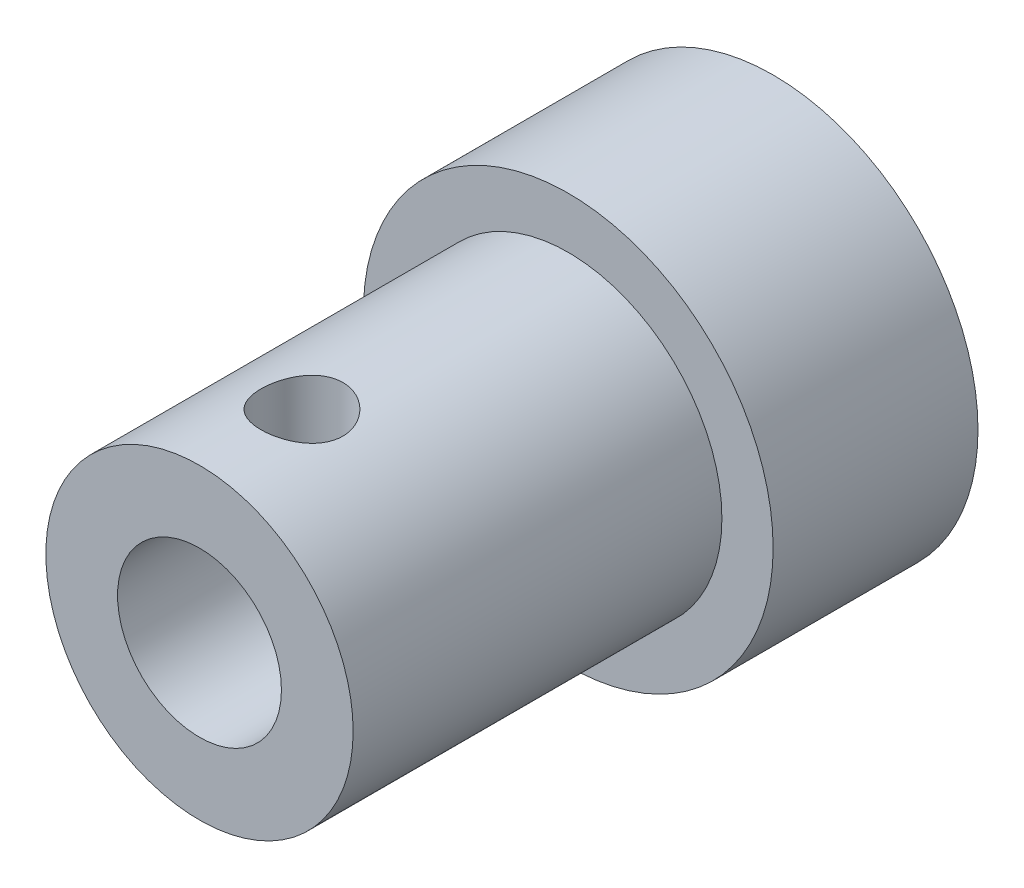
ISO-10303-21;
HEADER;
FILE_DESCRIPTION(('STEP AP214'),'2;1');
FILE_NAME('part.step','',(''),(''),'','','');
FILE_SCHEMA(('AUTOMOTIVE_DESIGN { 1 0 10303 214 1 1 1 1 }'));
ENDSEC;
DATA;
#1=APPLICATION_CONTEXT('core data for automotive mechanical design processes');
#2=APPLICATION_PROTOCOL_DEFINITION('international standard','automotive_design',2000,#1);
#3=PRODUCT_CONTEXT('',#1,'mechanical');
#4=PRODUCT('Part','Part','',(#3));
#5=PRODUCT_RELATED_PRODUCT_CATEGORY('part','',(#4));
#6=PRODUCT_DEFINITION_FORMATION('','',#4);
#7=PRODUCT_DEFINITION_CONTEXT('part definition',#1,'design');
#8=PRODUCT_DEFINITION('design','',#6,#7);
#9=PRODUCT_DEFINITION_SHAPE('','',#8);
#10=(LENGTH_UNIT() NAMED_UNIT(*) SI_UNIT(.MILLI.,.METRE.));
#11=(NAMED_UNIT(*) PLANE_ANGLE_UNIT() SI_UNIT($,.RADIAN.));
#12=(NAMED_UNIT(*) SI_UNIT($,.STERADIAN.) SOLID_ANGLE_UNIT());
#13=UNCERTAINTY_MEASURE_WITH_UNIT(LENGTH_MEASURE(1.E-05),#10,'distance_accuracy_value','');
#14=(GEOMETRIC_REPRESENTATION_CONTEXT(3) GLOBAL_UNCERTAINTY_ASSIGNED_CONTEXT((#13)) GLOBAL_UNIT_ASSIGNED_CONTEXT((#10,
#11,#12)) REPRESENTATION_CONTEXT('',''));
#15=CARTESIAN_POINT('',(0.,0.,0.));
#16=DIRECTION('',(0.,0.,1.));
#17=DIRECTION('',(1.,0.,0.));
#18=AXIS2_PLACEMENT_3D('',#15,#16,#17);
#19=CARTESIAN_POINT('',(0.,0.,-5.));
#20=DIRECTION('',(0.,0.,1.));
#21=DIRECTION('',(1.,0.,0.));
#22=AXIS2_PLACEMENT_3D('',#19,#20,#21);
#23=PLANE('',#22);
#24=CARTESIAN_POINT('',(1.63738784237748E-12,-7.,-5.));
#25=DIRECTION('',(0.,0.,-1.));
#26=DIRECTION('',(-1.,0.,0.));
#27=AXIS2_PLACEMENT_3D('',#24,#25,#26);
#28=CIRCLE('',#27,1.49999999999848);
#29=CARTESIAN_POINT('',(-1.49999999999684,-7.,-5.));
#30=VERTEX_POINT('',#29);
#31=EDGE_CURVE('E46',#30,#30,#28,.T.);
#32=ORIENTED_EDGE('',*,*,#31,.T.);
#33=EDGE_LOOP('',(#32));
#34=FACE_BOUND('',#33,.T.);
#35=ADVANCED_FACE('F33',(#34),#23,.F.);
#36=CARTESIAN_POINT('',(0.,7.,-5.));
#37=DIRECTION('',(0.,0.,-1.));
#38=DIRECTION('',(-1.,0.,0.));
#39=AXIS2_PLACEMENT_3D('',#36,#37,#38);
#40=CIRCLE('',#39,1.5);
#41=CARTESIAN_POINT('',(-1.5,7.,-5.));
#42=VERTEX_POINT('',#41);
#43=EDGE_CURVE('E51',#42,#42,#40,.T.);
#44=ORIENTED_EDGE('',*,*,#43,.T.);
#45=EDGE_LOOP('',(#44));
#46=FACE_BOUND('',#45,.T.);
#47=ADVANCED_FACE('F116',(#46),#23,.F.);
#48=CARTESIAN_POINT('',(-7.,-8.18693921188739E-13,-5.));
#49=DIRECTION('',(0.,0.,-1.));
#50=DIRECTION('',(-1.,0.,0.));
#51=AXIS2_PLACEMENT_3D('',#48,#49,#50);
#52=CIRCLE('',#51,1.49999999999924);
#53=CARTESIAN_POINT('',(-8.49999999999924,-8.18693921188739E-13,-5.));
#54=VERTEX_POINT('',#53);
#55=EDGE_CURVE('E125',#54,#54,#52,.T.);
#56=ORIENTED_EDGE('',*,*,#55,.T.);
#57=EDGE_LOOP('',(#56));
#58=FACE_BOUND('',#57,.T.);
#59=ADVANCED_FACE('F108',(#58),#23,.F.);
#60=CARTESIAN_POINT('',(0.,0.,-5.));
#61=DIRECTION('',(0.,0.,1.));
#62=DIRECTION('',(1.,0.,0.));
#63=AXIS2_PLACEMENT_3D('',#60,#61,#62);
#64=CYLINDRICAL_SURFACE('',#63,7.5);
#65=CARTESIAN_POINT('',(0.,0.,-3.));
#66=DIRECTION('',(0.,0.,1.));
#67=DIRECTION('',(1.,0.,0.));
#68=AXIS2_PLACEMENT_3D('',#65,#66,#67);
#69=CIRCLE('',#68,7.5);
#70=CARTESIAN_POINT('',(7.5,0.,-3.));
#71=VERTEX_POINT('',#70);
#72=EDGE_CURVE('E10',#71,#71,#69,.F.);
#73=ORIENTED_EDGE('',*,*,#72,.F.);
#74=EDGE_LOOP('',(#73));
#75=FACE_BOUND('',#74,.T.);
#76=CARTESIAN_POINT('',(0.,7.5,12.));
#77=CARTESIAN_POINT('',(0.110254555832854,7.49999833810161,11.9999973830651));
#78=CARTESIAN_POINT('',(0.220537160221841,7.49754486162151,11.9908523858103));
#79=CARTESIAN_POINT('',(0.437925451354464,7.48799573621659,11.9545787692613));
#80=CARTESIAN_POINT('',(0.545029583319086,7.48089785332586,11.9274414955739));
#81=CARTESIAN_POINT('',(0.752891589045312,7.4628433325279,11.856128333136));
#82=CARTESIAN_POINT('',(0.853657451015285,7.45189167130375,11.811974412334));
#83=CARTESIAN_POINT('',(1.04635368639266,7.42728699151678,11.7079627573334));
#84=CARTESIAN_POINT('',(1.13828347044963,7.4136337929518,11.6481039766407));
#85=CARTESIAN_POINT('',(1.31282950374002,7.38474614901995,11.5129164835866));
#86=CARTESIAN_POINT('',(1.39521168986279,7.36948467678681,11.4372913319917));
#87=CARTESIAN_POINT('',(1.54628713660638,7.33927409679591,11.2733515169366));
#88=CARTESIAN_POINT('',(1.61497863495664,7.32432502947243,11.1850352223825));
#89=CARTESIAN_POINT('',(1.73786409243415,7.29615537464372,10.9963517651746));
#90=CARTESIAN_POINT('',(1.79178877736487,7.28296888563239,10.8958036717383));
#91=CARTESIAN_POINT('',(1.88187548076994,7.26021477318187,10.6866598889076));
#92=CARTESIAN_POINT('',(1.91804077451369,7.25064648253265,10.5780656876686));
#93=CARTESIAN_POINT('',(1.97076920226504,7.23649115802399,10.358504462175));
#94=CARTESIAN_POINT('',(1.98775670244692,7.2317964781149,10.2476464600693));
#95=CARTESIAN_POINT('',(2.0029703470582,7.22759830916371,10.0245623166935));
#96=CARTESIAN_POINT('',(2.00119999705754,7.22809385014446,9.91233643497593));
#97=CARTESIAN_POINT('',(1.97928510002699,7.23412378802031,9.69301458462594));
#98=CARTESIAN_POINT('',(1.95965406064765,7.23951735511531,9.58586281796151));
#99=CARTESIAN_POINT('',(1.90339748722183,7.25451013080688,9.37643166554376));
#100=CARTESIAN_POINT('',(1.86677059492995,7.26410967552612,9.27415266992465));
#101=CARTESIAN_POINT('',(1.77714356965256,7.28655661748386,9.07603185619142));
#102=CARTESIAN_POINT('',(1.72396341137784,7.29943942818703,8.98027566071374));
#103=CARTESIAN_POINT('',(1.60286503823778,7.32698229642445,8.79886584114848));
#104=CARTESIAN_POINT('',(1.53494392224251,7.34164270355186,8.71321421084353));
#105=CARTESIAN_POINT('',(1.38366607263419,7.37167510629864,8.5515110025452));
#106=CARTESIAN_POINT('',(1.29987812728299,7.38705471488831,8.47586368168505));
#107=CARTESIAN_POINT('',(1.12061766820637,7.41636381276316,8.33961121964971));
#108=CARTESIAN_POINT('',(1.02514469420509,7.43029324488555,8.27900667129757));
#109=CARTESIAN_POINT('',(0.824598255497451,7.45521820398293,8.17438209717535));
#110=CARTESIAN_POINT('',(0.719484902551789,7.4662007283356,8.13043522955141));
#111=CARTESIAN_POINT('',(0.503002294390396,7.48390044400999,8.06095281118663));
#112=CARTESIAN_POINT('',(0.391634411928323,7.49061856733749,8.03541323727604));
#113=CARTESIAN_POINT('',(0.169254083145515,7.49889158558384,8.00410512308217));
#114=CARTESIAN_POINT('',(0.0583242376413805,7.50058997470959,7.99778696014913));
#115=CARTESIAN_POINT('',(-0.163010045901198,7.49904471691695,8.00358316424694));
#116=CARTESIAN_POINT('',(-0.273414537062113,7.49580158080353,8.01569562610577));
#117=CARTESIAN_POINT('',(-0.488602449901779,7.48483035496021,8.05755844745998));
#118=CARTESIAN_POINT('',(-0.593449852027781,7.4771802654633,8.08700224619776));
#119=CARTESIAN_POINT('',(-0.796706971176064,7.45826294894139,8.16233594450795));
#120=CARTESIAN_POINT('',(-0.895115989216027,7.44699532996161,8.20822762625055));
#121=CARTESIAN_POINT('',(-1.08483847466795,7.42175660559528,8.31617388718054));
#122=CARTESIAN_POINT('',(-1.17597518846118,7.40773686604957,8.37852746679774));
#123=CARTESIAN_POINT('',(-1.34668463539715,7.37861452365564,8.51725163015799));
#124=CARTESIAN_POINT('',(-1.42625507879918,7.3635117072752,8.59362498260105));
#125=CARTESIAN_POINT('',(-1.57388924478774,7.33339745866705,8.76078557749456));
#126=CARTESIAN_POINT('',(-1.64156519249816,7.31840061429312,8.85191856139517));
#127=CARTESIAN_POINT('',(-1.76067191185118,7.29066447182727,9.04456469609962));
#128=CARTESIAN_POINT('',(-1.81210336122161,7.27792507956316,9.1460774136223));
#129=CARTESIAN_POINT('',(-1.89687411586112,7.2562926837321,9.3560953070761));
#130=CARTESIAN_POINT('',(-1.93031812253958,7.24737748318009,9.46455581181758));
#131=CARTESIAN_POINT('',(-1.97841205118791,7.23439825126801,9.68583931967475));
#132=CARTESIAN_POINT('',(-1.99306677602478,7.23033298020014,9.79866120034792));
#133=CARTESIAN_POINT('',(-2.00288989653714,7.22761744573589,10.0214947878838));
#134=CARTESIAN_POINT('',(-1.99868155618109,7.22879397743239,10.1314773202583));
#135=CARTESIAN_POINT('',(-1.97234376000439,7.23602396081087,10.34910351401));
#136=CARTESIAN_POINT('',(-1.95021476535025,7.24207728699439,10.4567472355006));
#137=CARTESIAN_POINT('',(-1.88902515699699,7.25827571073158,10.6658557521298));
#138=CARTESIAN_POINT('',(-1.8500966107558,7.26838885019644,10.7673618427322));
#139=CARTESIAN_POINT('',(-1.75651554562386,7.29156818136177,10.9624788305341));
#140=CARTESIAN_POINT('',(-1.70186056024617,7.30463483621364,11.0560884863005));
#141=CARTESIAN_POINT('',(-1.57648909268817,7.3327292144046,11.2357303594966));
#142=CARTESIAN_POINT('',(-1.50534729767909,7.3478033310169,11.3214585349762));
#143=CARTESIAN_POINT('',(-1.349830535111,7.37795503783007,11.4799624516673));
#144=CARTESIAN_POINT('',(-1.26545235435875,7.39303262798441,11.5527350386688));
#145=CARTESIAN_POINT('',(-1.08367998108868,7.42187812403968,11.6847922376469));
#146=CARTESIAN_POINT('',(-0.986045961751779,7.43561111314551,11.7437550106493));
#147=CARTESIAN_POINT('',(-0.781888640416889,7.45983810102897,11.8443374159294));
#148=CARTESIAN_POINT('',(-0.675371094696297,7.47033417683594,11.8859681756636));
#149=CARTESIAN_POINT('',(-0.474374704880991,7.48554752513468,11.9452752854155));
#150=CARTESIAN_POINT('',(-0.380762016565036,7.49092770592602,11.9657493835925));
#151=CARTESIAN_POINT('',(-0.191439795317077,7.49815449036456,11.9931122061671));
#152=CARTESIAN_POINT('',(-0.0957304704048604,7.5000014429727,12.0000022722));
#153=CARTESIAN_POINT('',(0.,7.5,12.));
#154=B_SPLINE_CURVE_WITH_KNOTS('',3,(#76,#77,#78,#79,#80,#81,#82,#83,#84,#85,#86,#87,#88,#89,
#90,#91,#92,#93,#94,#95,#96,#97,#98,#99,#100,#101,#102,#103,#104,#105,#106,#107,#108,#109,#110,
#111,#112,#113,#114,#115,#116,#117,#118,#119,#120,#121,#122,#123,#124,#125,#126,#127,#128,#129,
#130,#131,#132,#133,#134,#135,#136,#137,#138,#139,#140,#141,#142,#143,#144,#145,#146,#147,#148,
#149,#150,#151,#152,#153),.UNSPECIFIED.,.T.,.F.,(4,2,2,2,2,2,2,2,2,2,2,2,2,2,2,2,2,2,2,2,2,2,2,
2,2,2,2,2,2,2,2,2,2,2,2,2,2,2,4),(0.,0.330412598949569,0.66098424376145,0.991130552971933,
1.32129886708675,1.65834897954967,1.99544244925149,2.33832582523229,2.681145941297,
3.01622158250468,3.3512346040432,3.67691002045997,4.0026114681294,4.33198673346498,
4.6614268811763,5.00161259812322,5.34181171937597,5.68348809603041,6.02508977190139,
6.35682717524547,6.6885302892535,7.01453535642116,7.34057575775614,7.6730028600455,
8.00549568258887,8.34736496382788,8.68921998024107,9.02906297699387,9.36881908663982,
9.69743342403611,10.0260393052059,10.352107654483,10.67822717123,11.0139433957139,
11.3497412433245,11.692722522809,12.0354832614518,12.3223981899334,12.6092847796638),.UNSPECIFIED.);
#155=CARTESIAN_POINT('',(0.,7.5,12.));
#156=VERTEX_POINT('',#155);
#157=EDGE_CURVE('E59',#156,#156,#154,.T.);
#158=ORIENTED_EDGE('',*,*,#157,.F.);
#159=EDGE_LOOP('',(#158));
#160=FACE_BOUND('',#159,.T.);
#161=CARTESIAN_POINT('',(0.,0.,15.));
#162=DIRECTION('',(0.,0.,1.));
#163=DIRECTION('',(1.,0.,0.));
#164=AXIS2_PLACEMENT_3D('',#161,#162,#163);
#165=CIRCLE('',#164,7.5);
#166=CARTESIAN_POINT('',(7.5,0.,15.));
#167=VERTEX_POINT('',#166);
#168=EDGE_CURVE('E149',#167,#167,#165,.T.);
#169=ORIENTED_EDGE('',*,*,#168,.F.);
#170=EDGE_LOOP('',(#169));
#171=FACE_BOUND('',#170,.T.);
#172=ADVANCED_FACE('F35',(#75,#160,#171),#64,.T.);
#173=CARTESIAN_POINT('',(7.,2.45452745133174E-12,-5.));
#174=DIRECTION('',(0.,0.,-1.));
#175=DIRECTION('',(-1.,0.,0.));
#176=AXIS2_PLACEMENT_3D('',#173,#174,#175);
#177=CIRCLE('',#176,1.49999999999772);
#178=CARTESIAN_POINT('',(5.50000000000228,2.45452745133174E-12,-5.));
#179=VERTEX_POINT('',#178);
#180=EDGE_CURVE('E141',#179,#179,#177,.T.);
#181=ORIENTED_EDGE('',*,*,#180,.T.);
#182=EDGE_LOOP('',(#181));
#183=FACE_BOUND('',#182,.T.);
#184=ADVANCED_FACE('F102',(#183),#23,.F.);
#185=CARTESIAN_POINT('',(0.,0.,-13.));
#186=DIRECTION('',(0.,0.,-1.));
#187=DIRECTION('',(-1.,0.,0.));
#188=AXIS2_PLACEMENT_3D('',#185,#186,#187);
#189=PLANE('',#188);
#190=CARTESIAN_POINT('',(0.,0.,-13.));
#191=DIRECTION('',(0.,0.,1.));
#192=DIRECTION('',(1.,0.,0.));
#193=AXIS2_PLACEMENT_3D('',#190,#191,#192);
#194=CIRCLE('',#193,4.);
#195=CARTESIAN_POINT('',(4.,0.,-13.));
#196=VERTEX_POINT('',#195);
#197=EDGE_CURVE('E56',#196,#196,#194,.T.);
#198=ORIENTED_EDGE('',*,*,#197,.T.);
#199=EDGE_LOOP('',(#198));
#200=FACE_BOUND('',#199,.T.);
#201=CARTESIAN_POINT('',(1.63738784237748E-12,-7.,-13.));
#202=DIRECTION('',(0.,0.,-1.));
#203=DIRECTION('',(-1.,0.,0.));
#204=AXIS2_PLACEMENT_3D('',#201,#202,#203);
#205=CIRCLE('',#204,1.49999999999848);
#206=CARTESIAN_POINT('',(-1.49999999999684,-7.,-13.));
#207=VERTEX_POINT('',#206);
#208=EDGE_CURVE('E128',#207,#207,#205,.T.);
#209=ORIENTED_EDGE('',*,*,#208,.F.);
#210=EDGE_LOOP('',(#209));
#211=FACE_BOUND('',#210,.T.);
#212=CARTESIAN_POINT('',(0.,7.,-13.));
#213=DIRECTION('',(0.,0.,-1.));
#214=DIRECTION('',(-1.,0.,0.));
#215=AXIS2_PLACEMENT_3D('',#212,#213,#214);
#216=CIRCLE('',#215,1.5);
#217=CARTESIAN_POINT('',(-1.5,7.,-13.));
#218=VERTEX_POINT('',#217);
#219=EDGE_CURVE('E131',#218,#218,#216,.T.);
#220=ORIENTED_EDGE('',*,*,#219,.F.);
#221=EDGE_LOOP('',(#220));
#222=FACE_BOUND('',#221,.T.);
#223=CARTESIAN_POINT('',(0.,0.,-13.));
#224=DIRECTION('',(0.,0.,-1.));
#225=DIRECTION('',(-1.,0.,0.));
#226=AXIS2_PLACEMENT_3D('',#223,#224,#225);
#227=CIRCLE('',#226,10.);
#228=CARTESIAN_POINT('',(-10.,0.,-13.));
#229=VERTEX_POINT('',#228);
#230=EDGE_CURVE('E139',#229,#229,#227,.T.);
#231=ORIENTED_EDGE('',*,*,#230,.T.);
#232=EDGE_LOOP('',(#231));
#233=FACE_BOUND('',#232,.T.);
#234=CARTESIAN_POINT('',(-7.,-8.18693921188739E-13,-13.));
#235=DIRECTION('',(0.,0.,-1.));
#236=DIRECTION('',(-1.,0.,0.));
#237=AXIS2_PLACEMENT_3D('',#234,#235,#236);
#238=CIRCLE('',#237,1.49999999999924);
#239=CARTESIAN_POINT('',(-8.49999999999924,-8.18693921188739E-13,-13.));
#240=VERTEX_POINT('',#239);
#241=EDGE_CURVE('E127',#240,#240,#238,.T.);
#242=ORIENTED_EDGE('',*,*,#241,.F.);
#243=EDGE_LOOP('',(#242));
#244=FACE_BOUND('',#243,.T.);
#245=CARTESIAN_POINT('',(7.,2.45452745133174E-12,-13.));
#246=DIRECTION('',(0.,0.,-1.));
#247=DIRECTION('',(-1.,0.,0.));
#248=AXIS2_PLACEMENT_3D('',#245,#246,#247);
#249=CIRCLE('',#248,1.49999999999772);
#250=CARTESIAN_POINT('',(5.50000000000228,2.45452745133174E-12,-13.));
#251=VERTEX_POINT('',#250);
#252=EDGE_CURVE('E134',#251,#251,#249,.T.);
#253=ORIENTED_EDGE('',*,*,#252,.F.);
#254=EDGE_LOOP('',(#253));
#255=FACE_BOUND('',#254,.T.);
#256=ADVANCED_FACE('F99',(#200,#211,#222,#233,#244,#255),#189,.T.);
#257=CARTESIAN_POINT('',(0.,0.,-13.));
#258=DIRECTION('',(0.,0.,1.));
#259=DIRECTION('',(1.,0.,0.));
#260=AXIS2_PLACEMENT_3D('',#257,#258,#259);
#261=CYLINDRICAL_SURFACE('',#260,10.);
#262=ORIENTED_EDGE('',*,*,#230,.F.);
#263=EDGE_LOOP('',(#262));
#264=FACE_BOUND('',#263,.T.);
#265=CARTESIAN_POINT('',(0.,0.,-3.));
#266=DIRECTION('',(0.,0.,1.));
#267=DIRECTION('',(1.,0.,0.));
#268=AXIS2_PLACEMENT_3D('',#265,#266,#267);
#269=CIRCLE('',#268,10.);
#270=CARTESIAN_POINT('',(10.,0.,-3.));
#271=VERTEX_POINT('',#270);
#272=EDGE_CURVE('E55',#271,#271,#269,.T.);
#273=ORIENTED_EDGE('',*,*,#272,.F.);
#274=EDGE_LOOP('',(#273));
#275=FACE_BOUND('',#274,.T.);
#276=ADVANCED_FACE('F97',(#264,#275),#261,.T.);
#277=CARTESIAN_POINT('',(0.,7.,-13.));
#278=DIRECTION('',(0.,0.,1.));
#279=DIRECTION('',(1.,0.,0.));
#280=AXIS2_PLACEMENT_3D('',#277,#278,#279);
#281=CYLINDRICAL_SURFACE('',#280,1.5);
#282=ORIENTED_EDGE('',*,*,#219,.T.);
#283=EDGE_LOOP('',(#282));
#284=FACE_BOUND('',#283,.T.);
#285=ORIENTED_EDGE('',*,*,#43,.F.);
#286=EDGE_LOOP('',(#285));
#287=FACE_BOUND('',#286,.T.);
#288=ADVANCED_FACE('F93',(#284,#287),#281,.F.);
#289=CARTESIAN_POINT('',(-7.,-8.18693921188739E-13,-13.));
#290=DIRECTION('',(0.,0.,1.));
#291=DIRECTION('',(1.,0.,0.));
#292=AXIS2_PLACEMENT_3D('',#289,#290,#291);
#293=CYLINDRICAL_SURFACE('',#292,1.49999999999924);
#294=ORIENTED_EDGE('',*,*,#241,.T.);
#295=EDGE_LOOP('',(#294));
#296=FACE_BOUND('',#295,.T.);
#297=ORIENTED_EDGE('',*,*,#55,.F.);
#298=EDGE_LOOP('',(#297));
#299=FACE_BOUND('',#298,.T.);
#300=ADVANCED_FACE('F89',(#296,#299),#293,.F.);
#301=CARTESIAN_POINT('',(1.63738784237748E-12,-7.,-13.));
#302=DIRECTION('',(0.,0.,1.));
#303=DIRECTION('',(1.,0.,0.));
#304=AXIS2_PLACEMENT_3D('',#301,#302,#303);
#305=CYLINDRICAL_SURFACE('',#304,1.49999999999848);
#306=ORIENTED_EDGE('',*,*,#208,.T.);
#307=EDGE_LOOP('',(#306));
#308=FACE_BOUND('',#307,.T.);
#309=ORIENTED_EDGE('',*,*,#31,.F.);
#310=EDGE_LOOP('',(#309));
#311=FACE_BOUND('',#310,.T.);
#312=ADVANCED_FACE('F85',(#308,#311),#305,.F.);
#313=CARTESIAN_POINT('',(7.,2.45452745133174E-12,-13.));
#314=DIRECTION('',(0.,0.,1.));
#315=DIRECTION('',(1.,0.,0.));
#316=AXIS2_PLACEMENT_3D('',#313,#314,#315);
#317=CYLINDRICAL_SURFACE('',#316,1.49999999999772);
#318=ORIENTED_EDGE('',*,*,#252,.T.);
#319=EDGE_LOOP('',(#318));
#320=FACE_BOUND('',#319,.T.);
#321=ORIENTED_EDGE('',*,*,#180,.F.);
#322=EDGE_LOOP('',(#321));
#323=FACE_BOUND('',#322,.T.);
#324=ADVANCED_FACE('F81',(#320,#323),#317,.F.);
#325=CARTESIAN_POINT('',(0.,0.,15.));
#326=DIRECTION('',(0.,0.,1.));
#327=DIRECTION('',(1.,0.,0.));
#328=AXIS2_PLACEMENT_3D('',#325,#326,#327);
#329=PLANE('',#328);
#330=ORIENTED_EDGE('',*,*,#168,.T.);
#331=EDGE_LOOP('',(#330));
#332=FACE_BOUND('',#331,.T.);
#333=CARTESIAN_POINT('',(0.,0.,15.));
#334=DIRECTION('',(0.,0.,1.));
#335=DIRECTION('',(1.,0.,0.));
#336=AXIS2_PLACEMENT_3D('',#333,#334,#335);
#337=CIRCLE('',#336,4.);
#338=CARTESIAN_POINT('',(4.,0.,15.));
#339=VERTEX_POINT('',#338);
#340=EDGE_CURVE('E64',#339,#339,#337,.T.);
#341=ORIENTED_EDGE('',*,*,#340,.F.);
#342=EDGE_LOOP('',(#341));
#343=FACE_BOUND('',#342,.T.);
#344=ADVANCED_FACE('F77',(#332,#343),#329,.T.);
#345=CARTESIAN_POINT('',(0.,0.,15.));
#346=DIRECTION('',(0.,0.,-1.));
#347=DIRECTION('',(-1.,0.,0.));
#348=AXIS2_PLACEMENT_3D('',#345,#346,#347);
#349=CYLINDRICAL_SURFACE('',#348,4.);
#350=CARTESIAN_POINT('',(0.,4.,12.));
#351=CARTESIAN_POINT('',(-0.105143925902467,3.99999426810082,11.9999933953656));
#352=CARTESIAN_POINT('',(-0.210413199395125,3.99580982039513,11.9916598537579));
#353=CARTESIAN_POINT('',(-0.417840470537792,3.97948312074314,11.9586942393169));
#354=CARTESIAN_POINT('',(-0.519992173427259,3.96732575657839,11.9340312140044));
#355=CARTESIAN_POINT('',(-0.717867089760898,3.93632558806751,11.8696123827667));
#356=CARTESIAN_POINT('',(-0.813613605878293,3.91750878355075,11.8299152315041));
#357=CARTESIAN_POINT('',(-0.996945233613198,3.87491553031523,11.73685875727));
#358=CARTESIAN_POINT('',(-1.08453098798012,3.8511394726705,11.6835005115023));
#359=CARTESIAN_POINT('',(-1.25501563552382,3.79912516516124,11.5609655010294));
#360=CARTESIAN_POINT('',(-1.33731042224422,3.77070398255074,11.4910270415207));
#361=CARTESIAN_POINT('',(-1.48955888973396,3.71319940493486,11.3389570415059));
#362=CARTESIAN_POINT('',(-1.55950316621353,3.68411552418069,11.2568162964551));
#363=CARTESIAN_POINT('',(-1.69050400090055,3.62597902394695,11.0750333009532));
#364=CARTESIAN_POINT('',(-1.75045067110327,3.59710373940264,10.9745278033082));
#365=CARTESIAN_POINT('',(-1.85233645378139,3.54571957544641,10.7632653280276));
#366=CARTESIAN_POINT('',(-1.89428842993267,3.52320615213979,10.6525157425545));
#367=CARTESIAN_POINT('',(-1.95626488437718,3.48915734075617,10.4306697891562));
#368=CARTESIAN_POINT('',(-1.97745171416088,3.47704543167427,10.3199910958652));
#369=CARTESIAN_POINT('',(-2.00085398661769,3.46363779897055,10.096042324441));
#370=CARTESIAN_POINT('',(-2.00308817674615,3.46233138686576,9.98277491825769));
#371=CARTESIAN_POINT('',(-1.98937457434459,3.47021860514497,9.77142795136926));
#372=CARTESIAN_POINT('',(-1.97556911907364,3.47817527324027,9.6731519375539));
#373=CARTESIAN_POINT('',(-1.93387969811386,3.50152457467701,9.48055618125391));
#374=CARTESIAN_POINT('',(-1.9059912477953,3.51691957663553,9.38623770938937));
#375=CARTESIAN_POINT('',(-1.83641956077201,3.55374952825482,9.20154173486868));
#376=CARTESIAN_POINT('',(-1.79443013423199,3.57531681327997,9.11130720242842));
#377=CARTESIAN_POINT('',(-1.698083375336,3.62206808562807,8.93873141481999));
#378=CARTESIAN_POINT('',(-1.64372048762493,3.64725369560381,8.85639372879982));
#379=CARTESIAN_POINT('',(-1.51613210982558,3.70226315806572,8.69095749451355));
#380=CARTESIAN_POINT('',(-1.44138891673856,3.73227020473492,8.60908625284769));
#381=CARTESIAN_POINT('',(-1.27911115748275,3.79095246600814,8.4585291628182));
#382=CARTESIAN_POINT('',(-1.19157051314857,3.81962703917602,8.38984961593223));
#383=CARTESIAN_POINT('',(-1.0010330116637,3.87403974565928,8.26462867794054));
#384=CARTESIAN_POINT('',(-0.897507183198817,3.89957968324015,8.20879905510852));
#385=CARTESIAN_POINT('',(-0.680932430977593,3.94315762242485,8.11580594191398));
#386=CARTESIAN_POINT('',(-0.567891152530551,3.96120157887106,8.07862762996967));
#387=CARTESIAN_POINT('',(-0.345532983321404,3.98648667482871,8.02704919256665));
#388=CARTESIAN_POINT('',(-0.236683061096652,3.9944987660262,8.01101752850644));
#389=CARTESIAN_POINT('',(-0.0175591998987035,4.00146026918207,7.99707053773102));
#390=CARTESIAN_POINT('',(0.0927140397398173,4.00041397442637,7.99914662872106));
#391=CARTESIAN_POINT('',(0.302465943971974,3.9898238450687,8.02041337683749));
#392=CARTESIAN_POINT('',(0.40211881609986,3.98094491376337,8.03826506545999));
#393=CARTESIAN_POINT('',(0.596813784603882,3.9564434262968,8.08847614379024));
#394=CARTESIAN_POINT('',(0.691855371382174,3.94082012668824,8.12083713290699));
#395=CARTESIAN_POINT('',(0.877777216899145,3.90368502827176,8.19999693286607));
#396=CARTESIAN_POINT('',(0.968460794011607,3.88201763539262,8.24718210023258));
#397=CARTESIAN_POINT('',(1.14092272339854,3.83487948634835,8.35421507129314));
#398=CARTESIAN_POINT('',(1.22269725955318,3.80940711133877,8.41406826919079));
#399=CARTESIAN_POINT('',(1.38353537857843,3.75416442672396,8.55152085066143));
#400=CARTESIAN_POINT('',(1.46154415563805,3.72421769686998,8.63028573689029));
#401=CARTESIAN_POINT('',(1.60371264223771,3.6652478321764,8.79985030255545));
#402=CARTESIAN_POINT('',(1.66786277142375,3.63622534800094,8.89065823769584));
#403=CARTESIAN_POINT('',(1.78341582895804,3.58102384412979,9.08728730834595));
#404=CARTESIAN_POINT('',(1.8340509916005,3.55505059178121,9.19362253218896));
#405=CARTESIAN_POINT('',(1.91616565186941,3.51148144588269,9.41502013514993));
#406=CARTESIAN_POINT('',(1.94766983173403,3.493874764435,9.53007105293378));
#407=CARTESIAN_POINT('',(1.98772337493374,3.47123002051604,9.75382044576941));
#408=CARTESIAN_POINT('',(1.9981859928109,3.4651476693013,9.86206850687048));
#409=CARTESIAN_POINT('',(2.0013783087524,3.46330709283207,10.078894134329));
#410=CARTESIAN_POINT('',(1.99411569324648,3.4675443925278,10.1874715374757));
#411=CARTESIAN_POINT('',(1.96385225118662,3.48475724102153,10.3909670030669));
#412=CARTESIAN_POINT('',(1.94241662868607,3.49686188965317,10.4862009402895));
#413=CARTESIAN_POINT('',(1.88635071644882,3.52742032375305,10.6716162388487));
#414=CARTESIAN_POINT('',(1.85171618231984,3.54587615139337,10.7617959641841));
#415=CARTESIAN_POINT('',(1.76763149060113,3.58857060729071,10.9412497019731));
#416=CARTESIAN_POINT('',(1.7173422756314,3.61311444791841,11.0300558036581));
#417=CARTESIAN_POINT('',(1.60430194327479,3.66470663269721,11.1985490723625));
#418=CARTESIAN_POINT('',(1.54154434248312,3.69175627591221,11.2782314610422));
#419=CARTESIAN_POINT('',(1.39640665332275,3.74924646316184,11.4362839647093));
#420=CARTESIAN_POINT('',(1.31256884599452,3.77969966613256,11.5133182047006));
#421=CARTESIAN_POINT('',(1.13230961246639,3.83755504519861,11.6525259668705));
#422=CARTESIAN_POINT('',(1.03588144661039,3.8649555725239,11.7146914789398));
#423=CARTESIAN_POINT('',(0.831863193565891,3.91396019133075,11.8224727254241));
#424=CARTESIAN_POINT('',(0.72419900755346,3.93552192987866,11.8679683384729));
#425=CARTESIAN_POINT('',(0.501484202276172,3.97002682597974,11.9396163355148));
#426=CARTESIAN_POINT('',(0.3864555991782,3.98299446726136,11.9658236936114));
#427=CARTESIAN_POINT('',(0.22520389298179,3.99390923826956,11.9877948221715));
#428=CARTESIAN_POINT('',(0.18032375888313,3.99618730680502,11.9923652817327));
#429=CARTESIAN_POINT('',(0.0903034636101831,3.99923393953631,11.9984693310282));
#430=CARTESIAN_POINT('',(0.0451632952932569,4.00000246206762,12.0000028369404));
#431=CARTESIAN_POINT('',(0.,4.,12.));
#432=B_SPLINE_CURVE_WITH_KNOTS('',3,(#350,#351,#352,#353,#354,#355,#356,#357,#358,#359,#360,
#361,#362,#363,#364,#365,#366,#367,#368,#369,#370,#371,#372,#373,#374,#375,#376,#377,#378,#379,
#380,#381,#382,#383,#384,#385,#386,#387,#388,#389,#390,#391,#392,#393,#394,#395,#396,#397,#398,
#399,#400,#401,#402,#403,#404,#405,#406,#407,#408,#409,#410,#411,#412,#413,#414,#415,#416,#417,
#418,#419,#420,#421,#422,#423,#424,#425,#426,#427,#428,#429,#430,#431),.UNSPECIFIED.,.T.,.F.,(4,
2,2,2,2,2,2,2,2,2,2,2,2,2,2,2,2,2,2,2,2,2,2,2,2,2,2,2,2,2,2,2,2,2,2,2,2,2,2,2,4),(0.,
0.315248514840585,0.631096299418395,0.945724310984598,1.26032752116314,1.59396351743618,
1.92785247530807,2.28763452861505,2.64715895796562,2.98516024280459,3.32282714658041,
3.62011424818641,3.91749607851357,4.22180480336974,4.52625042520444,4.86929882667756,
5.21251069197372,5.57166044428881,5.93052433824559,6.25966580942691,6.58865129022952,
6.89213813012244,7.19565843261863,7.50785712055797,7.82018901496678,8.16319221288837,
8.50643177230863,8.86629364323451,9.22569023890901,9.55058615006093,9.87534119729357,
10.1691586049771,10.463070575767,10.7767291356057,11.0905512228726,11.4425048551434,
11.7946476676249,12.1492802732705,12.502898172423,12.6383056026783,12.7737167702213),.UNSPECIFIED.);
#433=CARTESIAN_POINT('',(0.,4.,12.));
#434=VERTEX_POINT('',#433);
#435=EDGE_CURVE('E38',#434,#434,#432,.T.);
#436=ORIENTED_EDGE('',*,*,#435,.F.);
#437=EDGE_LOOP('',(#436));
#438=FACE_BOUND('',#437,.T.);
#439=ORIENTED_EDGE('',*,*,#340,.T.);
#440=EDGE_LOOP('',(#439));
#441=FACE_BOUND('',#440,.T.);
#442=ORIENTED_EDGE('',*,*,#197,.F.);
#443=EDGE_LOOP('',(#442));
#444=FACE_BOUND('',#443,.T.);
#445=ADVANCED_FACE('F71',(#438,#441,#444),#349,.F.);
#446=CARTESIAN_POINT('',(0.,0.500000000000017,10.));
#447=DIRECTION('',(0.,1.,0.));
#448=DIRECTION('',(0.,0.,1.));
#449=AXIS2_PLACEMENT_3D('',#446,#447,#448);
#450=CYLINDRICAL_SURFACE('',#449,2.);
#451=ORIENTED_EDGE('',*,*,#157,.T.);
#452=EDGE_LOOP('',(#451));
#453=FACE_BOUND('',#452,.T.);
#454=ORIENTED_EDGE('',*,*,#435,.T.);
#455=EDGE_LOOP('',(#454));
#456=FACE_BOUND('',#455,.T.);
#457=ADVANCED_FACE('F66',(#453,#456),#450,.F.);
#458=CARTESIAN_POINT('',(0.,0.,-3.));
#459=DIRECTION('',(0.,0.,1.));
#460=DIRECTION('',(1.,0.,0.));
#461=AXIS2_PLACEMENT_3D('',#458,#459,#460);
#462=PLANE('',#461);
#463=ORIENTED_EDGE('',*,*,#72,.T.);
#464=EDGE_LOOP('',(#463));
#465=FACE_BOUND('',#464,.T.);
#466=ORIENTED_EDGE('',*,*,#272,.T.);
#467=EDGE_LOOP('',(#466));
#468=FACE_BOUND('',#467,.T.);
#469=ADVANCED_FACE('F70',(#465,#468),#462,.T.);
#470=CLOSED_SHELL('',(#35,#47,#59,#172,#184,#256,#276,#288,#300,#312,#324,#344,#445,#457,#469));
#471=MANIFOLD_SOLID_BREP('B2',#470);
#472=ADVANCED_BREP_SHAPE_REPRESENTATION('',(#18,#471),#14);
#473=SHAPE_DEFINITION_REPRESENTATION(#9,#472);
ENDSEC;
END-ISO-10303-21;
